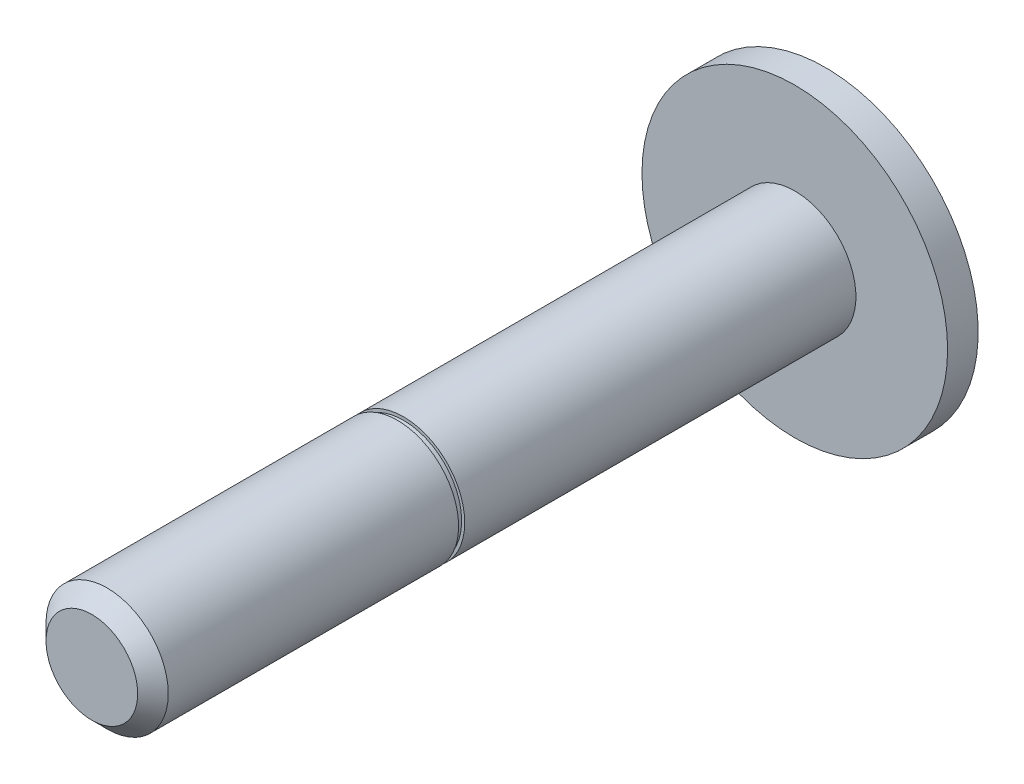
ISO-10303-21;
HEADER;
FILE_DESCRIPTION(('STEP AP214'),'2;1');
FILE_NAME('part.step','',(''),(''),'','','');
FILE_SCHEMA(('AUTOMOTIVE_DESIGN { 1 0 10303 214 1 1 1 1 }'));
ENDSEC;
DATA;
#1=APPLICATION_CONTEXT('core data for automotive mechanical design processes');
#2=APPLICATION_PROTOCOL_DEFINITION('international standard','automotive_design',2000,#1);
#3=PRODUCT_CONTEXT('',#1,'mechanical');
#4=PRODUCT('Part','Part','',(#3));
#5=PRODUCT_RELATED_PRODUCT_CATEGORY('part','',(#4));
#6=PRODUCT_DEFINITION_FORMATION('','',#4);
#7=PRODUCT_DEFINITION_CONTEXT('part definition',#1,'design');
#8=PRODUCT_DEFINITION('design','',#6,#7);
#9=PRODUCT_DEFINITION_SHAPE('','',#8);
#10=(LENGTH_UNIT() NAMED_UNIT(*) SI_UNIT(.MILLI.,.METRE.));
#11=(NAMED_UNIT(*) PLANE_ANGLE_UNIT() SI_UNIT($,.RADIAN.));
#12=(NAMED_UNIT(*) SI_UNIT($,.STERADIAN.) SOLID_ANGLE_UNIT());
#13=UNCERTAINTY_MEASURE_WITH_UNIT(LENGTH_MEASURE(1.E-05),#10,'distance_accuracy_value','');
#14=(GEOMETRIC_REPRESENTATION_CONTEXT(3) GLOBAL_UNCERTAINTY_ASSIGNED_CONTEXT((#13)) GLOBAL_UNIT_ASSIGNED_CONTEXT((#10,
#11,#12)) REPRESENTATION_CONTEXT('',''));
#15=CARTESIAN_POINT('',(0.,0.,0.));
#16=DIRECTION('',(0.,0.,1.));
#17=DIRECTION('',(1.,0.,0.));
#18=AXIS2_PLACEMENT_3D('',#15,#16,#17);
#19=CARTESIAN_POINT('',(0.,0.,32.5));
#20=DIRECTION('',(0.,0.,1.));
#21=DIRECTION('',(1.,0.,0.));
#22=AXIS2_PLACEMENT_3D('',#19,#20,#21);
#23=PLANE('',#22);
#24=CARTESIAN_POINT('',(0.,0.,32.5));
#25=DIRECTION('',(0.,0.,1.));
#26=DIRECTION('',(1.,0.,0.));
#27=AXIS2_PLACEMENT_3D('',#24,#25,#26);
#28=CIRCLE('',#27,1.5);
#29=CARTESIAN_POINT('',(-1.5,0.,32.5));
#30=VERTEX_POINT('',#29);
#31=EDGE_CURVE('E78',#30,#30,#28,.T.);
#32=ORIENTED_EDGE('',*,*,#31,.T.);
#33=EDGE_LOOP('',(#32));
#34=FACE_BOUND('',#33,.T.);
#35=ADVANCED_FACE('F16',(#34),#23,.T.);
#36=CARTESIAN_POINT('',(0.,2.,22.3));
#37=DIRECTION('',(0.,0.,-1.));
#38=DIRECTION('',(0.,-1.,0.));
#39=AXIS2_PLACEMENT_3D('',#36,#37,#38);
#40=PLANE('',#39);
#41=CARTESIAN_POINT('',(0.,0.,22.3));
#42=DIRECTION('',(0.,0.,-1.));
#43=DIRECTION('',(-1.,0.,0.));
#44=AXIS2_PLACEMENT_3D('',#41,#42,#43);
#45=CIRCLE('',#44,1.9);
#46=CARTESIAN_POINT('',(-1.9,0.,22.3));
#47=VERTEX_POINT('',#46);
#48=EDGE_CURVE('E20',#47,#47,#45,.T.);
#49=ORIENTED_EDGE('',*,*,#48,.T.);
#50=EDGE_LOOP('',(#49));
#51=FACE_BOUND('',#50,.T.);
#52=CARTESIAN_POINT('',(0.,0.,22.3));
#53=DIRECTION('',(0.,0.,-1.));
#54=DIRECTION('',(-1.,0.,0.));
#55=AXIS2_PLACEMENT_3D('',#52,#53,#54);
#56=CIRCLE('',#55,2.);
#57=CARTESIAN_POINT('',(2.,0.,22.3));
#58=VERTEX_POINT('',#57);
#59=EDGE_CURVE('E30',#58,#58,#56,.T.);
#60=ORIENTED_EDGE('',*,*,#59,.F.);
#61=EDGE_LOOP('',(#60));
#62=FACE_BOUND('',#61,.T.);
#63=ADVANCED_FACE('F183',(#51,#62),#40,.F.);
#64=CARTESIAN_POINT('',(0.,2.,22.5));
#65=DIRECTION('',(0.,0.,1.));
#66=DIRECTION('',(1.,0.,0.));
#67=AXIS2_PLACEMENT_3D('',#64,#65,#66);
#68=PLANE('',#67);
#69=CARTESIAN_POINT('',(0.,0.,22.5));
#70=DIRECTION('',(0.,0.,-1.));
#71=DIRECTION('',(-1.,0.,0.));
#72=AXIS2_PLACEMENT_3D('',#69,#70,#71);
#73=CIRCLE('',#72,1.9);
#74=CARTESIAN_POINT('',(1.9,0.,22.5));
#75=VERTEX_POINT('',#74);
#76=EDGE_CURVE('E85',#75,#75,#73,.T.);
#77=ORIENTED_EDGE('',*,*,#76,.F.);
#78=EDGE_LOOP('',(#77));
#79=FACE_BOUND('',#78,.T.);
#80=CARTESIAN_POINT('',(0.,0.,22.5));
#81=DIRECTION('',(0.,0.,-1.));
#82=DIRECTION('',(-1.,0.,0.));
#83=AXIS2_PLACEMENT_3D('',#80,#81,#82);
#84=CIRCLE('',#83,2.);
#85=CARTESIAN_POINT('',(-2.,0.,22.5));
#86=VERTEX_POINT('',#85);
#87=EDGE_CURVE('E84',#86,#86,#84,.T.);
#88=ORIENTED_EDGE('',*,*,#87,.T.);
#89=EDGE_LOOP('',(#88));
#90=FACE_BOUND('',#89,.T.);
#91=ADVANCED_FACE('F175',(#79,#90),#68,.F.);
#92=CARTESIAN_POINT('',(0.,0.,8.5));
#93=DIRECTION('',(0.,0.,1.));
#94=DIRECTION('',(1.,0.,0.));
#95=AXIS2_PLACEMENT_3D('',#92,#93,#94);
#96=PLANE('',#95);
#97=CARTESIAN_POINT('',(0.,0.,8.5));
#98=DIRECTION('',(0.,0.,-1.));
#99=DIRECTION('',(-1.,0.,0.));
#100=AXIS2_PLACEMENT_3D('',#97,#98,#99);
#101=CIRCLE('',#100,5.);
#102=CARTESIAN_POINT('',(-5.,0.,8.5));
#103=VERTEX_POINT('',#102);
#104=EDGE_CURVE('E54',#103,#103,#101,.T.);
#105=ORIENTED_EDGE('',*,*,#104,.T.);
#106=EDGE_LOOP('',(#105));
#107=FACE_BOUND('',#106,.T.);
#108=ADVANCED_FACE('F170',(#107),#96,.F.);
#109=CARTESIAN_POINT('',(0.,0.,9.5));
#110=DIRECTION('',(0.,0.,-1.));
#111=DIRECTION('',(0.,-1.,0.));
#112=AXIS2_PLACEMENT_3D('',#109,#110,#111);
#113=PLANE('',#112);
#114=CARTESIAN_POINT('',(0.,0.,9.5));
#115=DIRECTION('',(0.,0.,-1.));
#116=DIRECTION('',(-1.,0.,0.));
#117=AXIS2_PLACEMENT_3D('',#114,#115,#116);
#118=CIRCLE('',#117,2.);
#119=CARTESIAN_POINT('',(-2.,0.,9.5));
#120=VERTEX_POINT('',#119);
#121=EDGE_CURVE('E11',#120,#120,#118,.T.);
#122=ORIENTED_EDGE('',*,*,#121,.T.);
#123=EDGE_LOOP('',(#122));
#124=FACE_BOUND('',#123,.T.);
#125=CARTESIAN_POINT('',(0.,0.,9.5));
#126=DIRECTION('',(0.,0.,-1.));
#127=DIRECTION('',(-1.,0.,0.));
#128=AXIS2_PLACEMENT_3D('',#125,#126,#127);
#129=CIRCLE('',#128,5.);
#130=CARTESIAN_POINT('',(5.,0.,9.5));
#131=VERTEX_POINT('',#130);
#132=EDGE_CURVE('E58',#131,#131,#129,.T.);
#133=ORIENTED_EDGE('',*,*,#132,.F.);
#134=EDGE_LOOP('',(#133));
#135=FACE_BOUND('',#134,.T.);
#136=ADVANCED_FACE('F162',(#124,#135),#113,.F.);
#137=CARTESIAN_POINT('',(0.,0.,32.5));
#138=DIRECTION('',(0.,0.,-1.));
#139=DIRECTION('',(-1.,0.,0.));
#140=AXIS2_PLACEMENT_3D('',#137,#138,#139);
#141=CYLINDRICAL_SURFACE('',#140,2.);
#142=ORIENTED_EDGE('',*,*,#121,.F.);
#143=EDGE_LOOP('',(#142));
#144=FACE_BOUND('',#143,.T.);
#145=ORIENTED_EDGE('',*,*,#59,.T.);
#146=EDGE_LOOP('',(#145));
#147=FACE_BOUND('',#146,.T.);
#148=ADVANCED_FACE('F18',(#144,#147),#141,.T.);
#149=CARTESIAN_POINT('',(0.,0.,9.5));
#150=DIRECTION('',(0.,0.,-1.));
#151=DIRECTION('',(-1.,0.,0.));
#152=AXIS2_PLACEMENT_3D('',#149,#150,#151);
#153=CYLINDRICAL_SURFACE('',#152,5.);
#154=ORIENTED_EDGE('',*,*,#104,.F.);
#155=EDGE_LOOP('',(#154));
#156=FACE_BOUND('',#155,.T.);
#157=ORIENTED_EDGE('',*,*,#132,.T.);
#158=EDGE_LOOP('',(#157));
#159=FACE_BOUND('',#158,.T.);
#160=ADVANCED_FACE('F152',(#156,#159),#153,.T.);
#161=CARTESIAN_POINT('',(0.,0.,8.5));
#162=DIRECTION('',(0.,0.,-1.));
#163=DIRECTION('',(-1.,0.,0.));
#164=AXIS2_PLACEMENT_3D('',#161,#162,#163);
#165=CYLINDRICAL_SURFACE('',#164,1.9);
#166=ORIENTED_EDGE('',*,*,#48,.F.);
#167=EDGE_LOOP('',(#166));
#168=FACE_BOUND('',#167,.T.);
#169=ORIENTED_EDGE('',*,*,#76,.T.);
#170=EDGE_LOOP('',(#169));
#171=FACE_BOUND('',#170,.T.);
#172=ADVANCED_FACE('F146',(#168,#171),#165,.T.);
#173=CARTESIAN_POINT('',(0.,0.,32.5));
#174=DIRECTION('',(0.,0.,-1.));
#175=DIRECTION('',(-1.,0.,0.));
#176=AXIS2_PLACEMENT_3D('',#173,#174,#175);
#177=CONICAL_SURFACE('',#176,1.5,0.785398163397448);
#178=CARTESIAN_POINT('',(0.,0.,32.));
#179=DIRECTION('',(0.,0.,-1.));
#180=DIRECTION('',(1.,0.,0.));
#181=AXIS2_PLACEMENT_3D('',#178,#179,#180);
#182=CIRCLE('',#181,2.);
#183=CARTESIAN_POINT('',(2.,0.,32.));
#184=VERTEX_POINT('',#183);
#185=EDGE_CURVE('E89',#184,#184,#182,.T.);
#186=ORIENTED_EDGE('',*,*,#185,.F.);
#187=EDGE_LOOP('',(#186));
#188=FACE_BOUND('',#187,.T.);
#189=ORIENTED_EDGE('',*,*,#31,.F.);
#190=EDGE_LOOP('',(#189));
#191=FACE_BOUND('',#190,.T.);
#192=ADVANCED_FACE('F141',(#188,#191),#177,.T.);
#193=CARTESIAN_POINT('',(0.,0.,32.5));
#194=DIRECTION('',(0.,0.,-1.));
#195=DIRECTION('',(-1.,0.,0.));
#196=AXIS2_PLACEMENT_3D('',#193,#194,#195);
#197=CYLINDRICAL_SURFACE('',#196,2.);
#198=ORIENTED_EDGE('',*,*,#87,.F.);
#199=EDGE_LOOP('',(#198));
#200=FACE_BOUND('',#199,.T.);
#201=ORIENTED_EDGE('',*,*,#185,.T.);
#202=EDGE_LOOP('',(#201));
#203=FACE_BOUND('',#202,.T.);
#204=ADVANCED_FACE('F150',(#200,#203),#197,.T.);
#205=CLOSED_SHELL('',(#35,#63,#91,#108,#136,#148,#160,#172,#192,#204));
#206=MANIFOLD_SOLID_BREP('B1',#205);
#207=ADVANCED_BREP_SHAPE_REPRESENTATION('',(#18,#206),#14);
#208=SHAPE_DEFINITION_REPRESENTATION(#9,#207);
ENDSEC;
END-ISO-10303-21;
